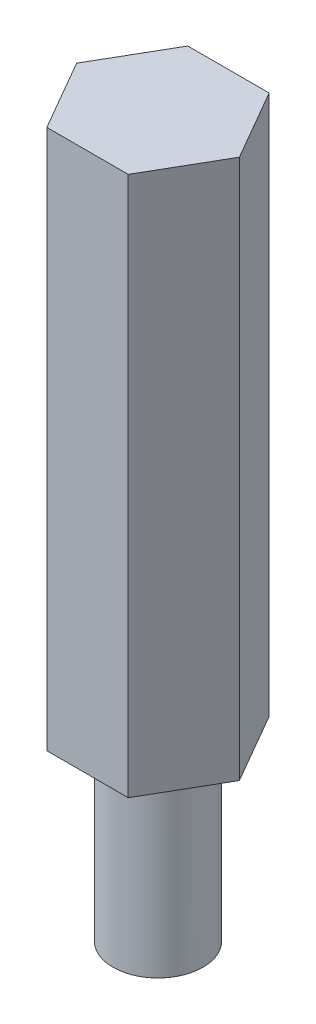
ISO-10303-21;
HEADER;
FILE_DESCRIPTION(('STEP AP214'),'2;1');
FILE_NAME('part.step','',(''),(''),'','','');
FILE_SCHEMA(('AUTOMOTIVE_DESIGN { 1 0 10303 214 1 1 1 1 }'));
ENDSEC;
DATA;
#1=APPLICATION_CONTEXT('core data for automotive mechanical design processes');
#2=APPLICATION_PROTOCOL_DEFINITION('international standard','automotive_design',2000,#1);
#3=PRODUCT_CONTEXT('',#1,'mechanical');
#4=PRODUCT('Part','Part','',(#3));
#5=PRODUCT_RELATED_PRODUCT_CATEGORY('part','',(#4));
#6=PRODUCT_DEFINITION_FORMATION('','',#4);
#7=PRODUCT_DEFINITION_CONTEXT('part definition',#1,'design');
#8=PRODUCT_DEFINITION('design','',#6,#7);
#9=PRODUCT_DEFINITION_SHAPE('','',#8);
#10=(LENGTH_UNIT() NAMED_UNIT(*) SI_UNIT(.MILLI.,.METRE.));
#11=(NAMED_UNIT(*) PLANE_ANGLE_UNIT() SI_UNIT($,.RADIAN.));
#12=(NAMED_UNIT(*) SI_UNIT($,.STERADIAN.) SOLID_ANGLE_UNIT());
#13=UNCERTAINTY_MEASURE_WITH_UNIT(LENGTH_MEASURE(1.E-05),#10,'distance_accuracy_value','');
#14=(GEOMETRIC_REPRESENTATION_CONTEXT(3) GLOBAL_UNCERTAINTY_ASSIGNED_CONTEXT((#13)) GLOBAL_UNIT_ASSIGNED_CONTEXT((#10,
#11,#12)) REPRESENTATION_CONTEXT('',''));
#15=CARTESIAN_POINT('',(0.,0.,0.));
#16=DIRECTION('',(0.,0.,1.));
#17=DIRECTION('',(1.,0.,0.));
#18=AXIS2_PLACEMENT_3D('',#15,#16,#17);
#19=CARTESIAN_POINT('',(1.35677313259562,18.,-2.35));
#20=DIRECTION('',(0.,0.,1.));
#21=DIRECTION('',(1.,0.,0.));
#22=AXIS2_PLACEMENT_3D('',#19,#20,#21);
#23=PLANE('',#22);
#24=DIRECTION('',(-1.,0.,0.));
#25=VECTOR('',#24,1.);
#26=CARTESIAN_POINT('',(1.35677313259562,0.,-2.35));
#27=LINE('',#26,#25);
#28=CARTESIAN_POINT('',(1.35677313259562,0.,-2.35));
#29=VERTEX_POINT('',#28);
#30=CARTESIAN_POINT('',(-1.35677313259562,0.,-2.35));
#31=VERTEX_POINT('',#30);
#32=EDGE_CURVE('E119',#29,#31,#27,.T.);
#33=ORIENTED_EDGE('',*,*,#32,.T.);
#34=DIRECTION('',(0.,-1.,0.));
#35=VECTOR('',#34,1.);
#36=CARTESIAN_POINT('',(-1.35677313259562,18.,-2.35));
#37=LINE('',#36,#35);
#38=CARTESIAN_POINT('',(-1.35677313259562,18.,-2.35));
#39=VERTEX_POINT('',#38);
#40=EDGE_CURVE('E42',#39,#31,#37,.T.);
#41=ORIENTED_EDGE('',*,*,#40,.F.);
#42=DIRECTION('',(-1.,0.,0.));
#43=VECTOR('',#42,1.);
#44=CARTESIAN_POINT('',(1.35677313259562,18.,-2.35));
#45=LINE('',#44,#43);
#46=CARTESIAN_POINT('',(1.35677313259562,18.,-2.35));
#47=VERTEX_POINT('',#46);
#48=EDGE_CURVE('E130',#47,#39,#45,.T.);
#49=ORIENTED_EDGE('',*,*,#48,.F.);
#50=DIRECTION('',(0.,-1.,0.));
#51=VECTOR('',#50,1.);
#52=CARTESIAN_POINT('',(1.35677313259562,18.,-2.35));
#53=LINE('',#52,#51);
#54=EDGE_CURVE('E115',#47,#29,#53,.T.);
#55=ORIENTED_EDGE('',*,*,#54,.T.);
#56=EDGE_LOOP('',(#33,#41,#49,#55));
#57=FACE_BOUND('',#56,.T.);
#58=ADVANCED_FACE('F34',(#57),#23,.F.);
#59=CARTESIAN_POINT('',(-1.35677313259562,18.,-2.35));
#60=DIRECTION('',(0.866025403784439,0.,0.5));
#61=DIRECTION('',(0.5,0.,-0.866025403784439));
#62=AXIS2_PLACEMENT_3D('',#59,#60,#61);
#63=PLANE('',#62);
#64=DIRECTION('',(-0.5,0.,0.866025403784439));
#65=VECTOR('',#64,1.);
#66=CARTESIAN_POINT('',(-1.35677313259562,0.,-2.35));
#67=LINE('',#66,#65);
#68=CARTESIAN_POINT('',(-2.71354626519124,0.,0.));
#69=VERTEX_POINT('',#68);
#70=EDGE_CURVE('E122',#31,#69,#67,.T.);
#71=ORIENTED_EDGE('',*,*,#70,.T.);
#72=DIRECTION('',(0.,-1.,0.));
#73=VECTOR('',#72,1.);
#74=CARTESIAN_POINT('',(-2.71354626519124,18.,0.));
#75=LINE('',#74,#73);
#76=CARTESIAN_POINT('',(-2.71354626519124,18.,0.));
#77=VERTEX_POINT('',#76);
#78=EDGE_CURVE('E134',#77,#69,#75,.T.);
#79=ORIENTED_EDGE('',*,*,#78,.F.);
#80=DIRECTION('',(-0.5,0.,0.866025403784439));
#81=VECTOR('',#80,1.);
#82=CARTESIAN_POINT('',(-1.35677313259562,18.,-2.35));
#83=LINE('',#82,#81);
#84=EDGE_CURVE('E88',#39,#77,#83,.T.);
#85=ORIENTED_EDGE('',*,*,#84,.F.);
#86=ORIENTED_EDGE('',*,*,#40,.T.);
#87=EDGE_LOOP('',(#71,#79,#85,#86));
#88=FACE_BOUND('',#87,.T.);
#89=ADVANCED_FACE('F137',(#88),#63,.F.);
#90=CARTESIAN_POINT('',(-2.71354626519124,18.,0.));
#91=DIRECTION('',(0.866025403784438,0.,-0.5));
#92=DIRECTION('',(-0.5,0.,-0.866025403784439));
#93=AXIS2_PLACEMENT_3D('',#90,#91,#92);
#94=PLANE('',#93);
#95=DIRECTION('',(0.5,0.,0.866025403784438));
#96=VECTOR('',#95,1.);
#97=CARTESIAN_POINT('',(-2.71354626519124,0.,0.));
#98=LINE('',#97,#96);
#99=CARTESIAN_POINT('',(-1.35677313259562,0.,2.35));
#100=VERTEX_POINT('',#99);
#101=EDGE_CURVE('E125',#69,#100,#98,.T.);
#102=ORIENTED_EDGE('',*,*,#101,.T.);
#103=DIRECTION('',(0.,-1.,0.));
#104=VECTOR('',#103,1.);
#105=CARTESIAN_POINT('',(-1.35677313259562,18.,2.35));
#106=LINE('',#105,#104);
#107=CARTESIAN_POINT('',(-1.35677313259562,18.,2.35));
#108=VERTEX_POINT('',#107);
#109=EDGE_CURVE('E110',#108,#100,#106,.T.);
#110=ORIENTED_EDGE('',*,*,#109,.F.);
#111=DIRECTION('',(0.5,0.,0.866025403784438));
#112=VECTOR('',#111,1.);
#113=CARTESIAN_POINT('',(-2.71354626519124,18.,0.));
#114=LINE('',#113,#112);
#115=EDGE_CURVE('E101',#77,#108,#114,.T.);
#116=ORIENTED_EDGE('',*,*,#115,.F.);
#117=ORIENTED_EDGE('',*,*,#78,.T.);
#118=EDGE_LOOP('',(#102,#110,#116,#117));
#119=FACE_BOUND('',#118,.T.);
#120=ADVANCED_FACE('F145',(#119),#94,.F.);
#121=CARTESIAN_POINT('',(-1.35677313259562,18.,2.35));
#122=DIRECTION('',(0.,0.,-1.));
#123=DIRECTION('',(-1.,0.,0.));
#124=AXIS2_PLACEMENT_3D('',#121,#122,#123);
#125=PLANE('',#124);
#126=DIRECTION('',(1.,0.,0.));
#127=VECTOR('',#126,1.);
#128=CARTESIAN_POINT('',(-1.35677313259562,0.,2.35));
#129=LINE('',#128,#127);
#130=CARTESIAN_POINT('',(1.35677313259562,0.,2.35));
#131=VERTEX_POINT('',#130);
#132=EDGE_CURVE('E109',#100,#131,#129,.T.);
#133=ORIENTED_EDGE('',*,*,#132,.T.);
#134=DIRECTION('',(0.,-1.,0.));
#135=VECTOR('',#134,1.);
#136=CARTESIAN_POINT('',(1.35677313259562,18.,2.35));
#137=LINE('',#136,#135);
#138=CARTESIAN_POINT('',(1.35677313259562,18.,2.35));
#139=VERTEX_POINT('',#138);
#140=EDGE_CURVE('E106',#139,#131,#137,.T.);
#141=ORIENTED_EDGE('',*,*,#140,.F.);
#142=DIRECTION('',(1.,0.,0.));
#143=VECTOR('',#142,1.);
#144=CARTESIAN_POINT('',(-1.35677313259562,18.,2.35));
#145=LINE('',#144,#143);
#146=EDGE_CURVE('E95',#108,#139,#145,.T.);
#147=ORIENTED_EDGE('',*,*,#146,.F.);
#148=ORIENTED_EDGE('',*,*,#109,.T.);
#149=EDGE_LOOP('',(#133,#141,#147,#148));
#150=FACE_BOUND('',#149,.T.);
#151=ADVANCED_FACE('F107',(#150),#125,.F.);
#152=CARTESIAN_POINT('',(1.35677313259562,18.,2.35));
#153=DIRECTION('',(-0.866025403784439,0.,-0.5));
#154=DIRECTION('',(-0.5,0.,0.866025403784439));
#155=AXIS2_PLACEMENT_3D('',#152,#153,#154);
#156=PLANE('',#155);
#157=DIRECTION('',(0.5,0.,-0.866025403784439));
#158=VECTOR('',#157,1.);
#159=CARTESIAN_POINT('',(1.35677313259562,0.,2.35));
#160=LINE('',#159,#158);
#161=CARTESIAN_POINT('',(2.71354626519124,0.,0.));
#162=VERTEX_POINT('',#161);
#163=EDGE_CURVE('E73',#131,#162,#160,.T.);
#164=ORIENTED_EDGE('',*,*,#163,.T.);
#165=DIRECTION('',(0.,-1.,0.));
#166=VECTOR('',#165,1.);
#167=CARTESIAN_POINT('',(2.71354626519124,18.,0.));
#168=LINE('',#167,#166);
#169=CARTESIAN_POINT('',(2.71354626519124,18.,0.));
#170=VERTEX_POINT('',#169);
#171=EDGE_CURVE('E111',#170,#162,#168,.T.);
#172=ORIENTED_EDGE('',*,*,#171,.F.);
#173=DIRECTION('',(0.5,0.,-0.866025403784439));
#174=VECTOR('',#173,1.);
#175=CARTESIAN_POINT('',(1.35677313259562,18.,2.35));
#176=LINE('',#175,#174);
#177=EDGE_CURVE('E99',#139,#170,#176,.T.);
#178=ORIENTED_EDGE('',*,*,#177,.F.);
#179=ORIENTED_EDGE('',*,*,#140,.T.);
#180=EDGE_LOOP('',(#164,#172,#178,#179));
#181=FACE_BOUND('',#180,.T.);
#182=ADVANCED_FACE('F113',(#181),#156,.F.);
#183=CARTESIAN_POINT('',(2.71354626519124,18.,0.));
#184=DIRECTION('',(-0.866025403784439,0.,0.5));
#185=DIRECTION('',(0.5,0.,0.866025403784439));
#186=AXIS2_PLACEMENT_3D('',#183,#184,#185);
#187=PLANE('',#186);
#188=DIRECTION('',(-0.5,0.,-0.866025403784439));
#189=VECTOR('',#188,1.);
#190=CARTESIAN_POINT('',(2.71354626519124,0.,0.));
#191=LINE('',#190,#189);
#192=EDGE_CURVE('E79',#162,#29,#191,.T.);
#193=ORIENTED_EDGE('',*,*,#192,.T.);
#194=ORIENTED_EDGE('',*,*,#54,.F.);
#195=DIRECTION('',(-0.5,0.,-0.866025403784439));
#196=VECTOR('',#195,1.);
#197=CARTESIAN_POINT('',(2.71354626519124,18.,0.));
#198=LINE('',#197,#196);
#199=EDGE_CURVE('E50',#170,#47,#198,.T.);
#200=ORIENTED_EDGE('',*,*,#199,.F.);
#201=ORIENTED_EDGE('',*,*,#171,.T.);
#202=EDGE_LOOP('',(#193,#194,#200,#201));
#203=FACE_BOUND('',#202,.T.);
#204=ADVANCED_FACE('F165',(#203),#187,.F.);
#205=CARTESIAN_POINT('',(0.,18.,0.));
#206=DIRECTION('',(0.,1.,0.));
#207=DIRECTION('',(0.,0.,1.));
#208=AXIS2_PLACEMENT_3D('',#205,#206,#207);
#209=PLANE('',#208);
#210=ORIENTED_EDGE('',*,*,#48,.T.);
#211=ORIENTED_EDGE('',*,*,#84,.T.);
#212=ORIENTED_EDGE('',*,*,#115,.T.);
#213=ORIENTED_EDGE('',*,*,#146,.T.);
#214=ORIENTED_EDGE('',*,*,#177,.T.);
#215=ORIENTED_EDGE('',*,*,#199,.T.);
#216=EDGE_LOOP('',(#210,#211,#212,#213,#214,#215));
#217=FACE_BOUND('',#216,.T.);
#218=ADVANCED_FACE('F97',(#217),#209,.T.);
#219=CARTESIAN_POINT('',(0.,0.,0.));
#220=DIRECTION('',(0.,1.,0.));
#221=DIRECTION('',(0.,0.,1.));
#222=AXIS2_PLACEMENT_3D('',#219,#220,#221);
#223=PLANE('',#222);
#224=CARTESIAN_POINT('',(0.,0.,0.));
#225=DIRECTION('',(0.,1.,0.));
#226=DIRECTION('',(0.,0.,1.));
#227=AXIS2_PLACEMENT_3D('',#224,#225,#226);
#228=CIRCLE('',#227,1.5);
#229=CARTESIAN_POINT('',(0.,0.,1.5));
#230=VERTEX_POINT('',#229);
#231=EDGE_CURVE('E11',#230,#230,#228,.F.);
#232=ORIENTED_EDGE('',*,*,#231,.F.);
#233=EDGE_LOOP('',(#232));
#234=FACE_BOUND('',#233,.T.);
#235=ORIENTED_EDGE('',*,*,#32,.F.);
#236=ORIENTED_EDGE('',*,*,#192,.F.);
#237=ORIENTED_EDGE('',*,*,#163,.F.);
#238=ORIENTED_EDGE('',*,*,#132,.F.);
#239=ORIENTED_EDGE('',*,*,#101,.F.);
#240=ORIENTED_EDGE('',*,*,#70,.F.);
#241=EDGE_LOOP('',(#235,#236,#237,#238,#239,#240));
#242=FACE_BOUND('',#241,.T.);
#243=ADVANCED_FACE('F142',(#234,#242),#223,.F.);
#244=CARTESIAN_POINT('',(0.,-6.,0.));
#245=DIRECTION('',(0.,1.,0.));
#246=DIRECTION('',(0.,0.,1.));
#247=AXIS2_PLACEMENT_3D('',#244,#245,#246);
#248=CYLINDRICAL_SURFACE('',#247,1.5);
#249=CARTESIAN_POINT('',(0.,-6.,0.));
#250=DIRECTION('',(0.,-1.,0.));
#251=DIRECTION('',(0.,0.,-1.));
#252=AXIS2_PLACEMENT_3D('',#249,#250,#251);
#253=CIRCLE('',#252,1.5);
#254=CARTESIAN_POINT('',(0.,-6.,-1.5));
#255=VERTEX_POINT('',#254);
#256=EDGE_CURVE('E123',#255,#255,#253,.T.);
#257=ORIENTED_EDGE('',*,*,#256,.F.);
#258=EDGE_LOOP('',(#257));
#259=FACE_BOUND('',#258,.T.);
#260=ORIENTED_EDGE('',*,*,#231,.T.);
#261=EDGE_LOOP('',(#260));
#262=FACE_BOUND('',#261,.T.);
#263=ADVANCED_FACE('F154',(#259,#262),#248,.T.);
#264=CARTESIAN_POINT('',(0.,-6.,0.));
#265=DIRECTION('',(0.,-1.,0.));
#266=DIRECTION('',(0.,0.,-1.));
#267=AXIS2_PLACEMENT_3D('',#264,#265,#266);
#268=PLANE('',#267);
#269=ORIENTED_EDGE('',*,*,#256,.T.);
#270=EDGE_LOOP('',(#269));
#271=FACE_BOUND('',#270,.T.);
#272=ADVANCED_FACE('F152',(#271),#268,.T.);
#273=CLOSED_SHELL('',(#58,#89,#120,#151,#182,#204,#218,#243,#263,#272));
#274=MANIFOLD_SOLID_BREP('B2',#273);
#275=ADVANCED_BREP_SHAPE_REPRESENTATION('',(#18,#274),#14);
#276=SHAPE_DEFINITION_REPRESENTATION(#9,#275);
ENDSEC;
END-ISO-10303-21;
